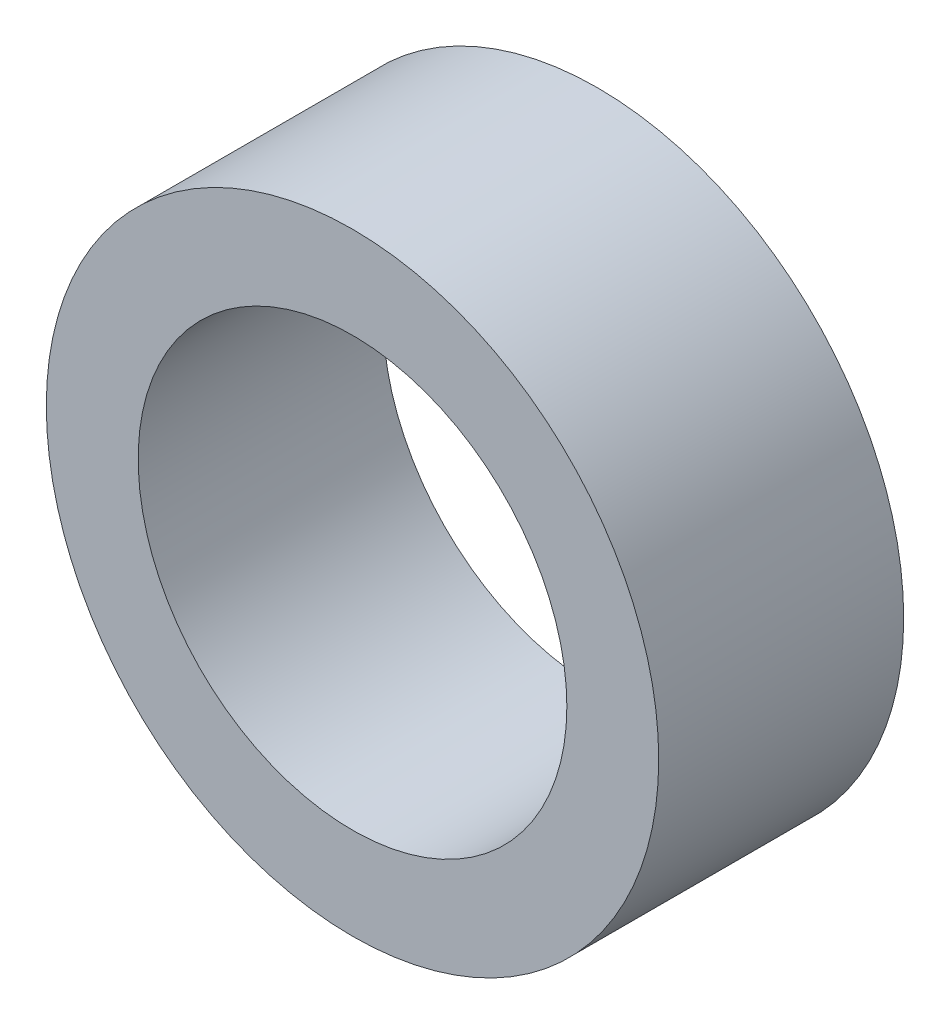
ISO-10303-21;
HEADER;
FILE_DESCRIPTION(('STEP AP214'),'2;1');
FILE_NAME('part.step','',(''),(''),'','','');
FILE_SCHEMA(('AUTOMOTIVE_DESIGN { 1 0 10303 214 1 1 1 1 }'));
ENDSEC;
DATA;
#1=APPLICATION_CONTEXT('core data for automotive mechanical design processes');
#2=APPLICATION_PROTOCOL_DEFINITION('international standard','automotive_design',2000,#1);
#3=PRODUCT_CONTEXT('',#1,'mechanical');
#4=PRODUCT('Part','Part','',(#3));
#5=PRODUCT_RELATED_PRODUCT_CATEGORY('part','',(#4));
#6=PRODUCT_DEFINITION_FORMATION('','',#4);
#7=PRODUCT_DEFINITION_CONTEXT('part definition',#1,'design');
#8=PRODUCT_DEFINITION('design','',#6,#7);
#9=PRODUCT_DEFINITION_SHAPE('','',#8);
#10=(LENGTH_UNIT() NAMED_UNIT(*) SI_UNIT(.MILLI.,.METRE.));
#11=(NAMED_UNIT(*) PLANE_ANGLE_UNIT() SI_UNIT($,.RADIAN.));
#12=(NAMED_UNIT(*) SI_UNIT($,.STERADIAN.) SOLID_ANGLE_UNIT());
#13=UNCERTAINTY_MEASURE_WITH_UNIT(LENGTH_MEASURE(1.E-05),#10,'distance_accuracy_value','');
#14=(GEOMETRIC_REPRESENTATION_CONTEXT(3) GLOBAL_UNCERTAINTY_ASSIGNED_CONTEXT((#13)) GLOBAL_UNIT_ASSIGNED_CONTEXT((#10,
#11,#12)) REPRESENTATION_CONTEXT('',''));
#15=CARTESIAN_POINT('',(0.,0.,0.));
#16=DIRECTION('',(0.,0.,1.));
#17=DIRECTION('',(1.,0.,0.));
#18=AXIS2_PLACEMENT_3D('',#15,#16,#17);
#19=CARTESIAN_POINT('',(0.,0.,20.));
#20=DIRECTION('',(0.,0.,1.));
#21=DIRECTION('',(1.,0.,0.));
#22=AXIS2_PLACEMENT_3D('',#19,#20,#21);
#23=PLANE('',#22);
#24=CARTESIAN_POINT('',(0.,0.,20.));
#25=DIRECTION('',(0.,0.,1.));
#26=DIRECTION('',(1.,0.,0.));
#27=AXIS2_PLACEMENT_3D('',#24,#25,#26);
#28=CIRCLE('',#27,25.);
#29=CARTESIAN_POINT('',(25.,0.,20.));
#30=VERTEX_POINT('',#29);
#31=EDGE_CURVE('E10',#30,#30,#28,.T.);
#32=ORIENTED_EDGE('',*,*,#31,.T.);
#33=EDGE_LOOP('',(#32));
#34=FACE_BOUND('',#33,.T.);
#35=CARTESIAN_POINT('',(0.,0.,20.));
#36=DIRECTION('',(0.,0.,1.));
#37=DIRECTION('',(1.,0.,0.));
#38=AXIS2_PLACEMENT_3D('',#35,#36,#37);
#39=CIRCLE('',#38,17.5);
#40=CARTESIAN_POINT('',(17.5,0.,20.));
#41=VERTEX_POINT('',#40);
#42=EDGE_CURVE('E42',#41,#41,#39,.T.);
#43=ORIENTED_EDGE('',*,*,#42,.F.);
#44=EDGE_LOOP('',(#43));
#45=FACE_BOUND('',#44,.T.);
#46=ADVANCED_FACE('F31',(#34,#45),#23,.T.);
#47=CARTESIAN_POINT('',(0.,0.,0.));
#48=DIRECTION('',(0.,0.,1.));
#49=DIRECTION('',(1.,0.,0.));
#50=AXIS2_PLACEMENT_3D('',#47,#48,#49);
#51=PLANE('',#50);
#52=CARTESIAN_POINT('',(0.,0.,0.));
#53=DIRECTION('',(0.,0.,1.));
#54=DIRECTION('',(1.,0.,0.));
#55=AXIS2_PLACEMENT_3D('',#52,#53,#54);
#56=CIRCLE('',#55,25.);
#57=CARTESIAN_POINT('',(25.,0.,0.));
#58=VERTEX_POINT('',#57);
#59=EDGE_CURVE('E35',#58,#58,#56,.T.);
#60=ORIENTED_EDGE('',*,*,#59,.F.);
#61=EDGE_LOOP('',(#60));
#62=FACE_BOUND('',#61,.T.);
#63=CARTESIAN_POINT('',(0.,0.,0.));
#64=DIRECTION('',(0.,0.,1.));
#65=DIRECTION('',(1.,0.,0.));
#66=AXIS2_PLACEMENT_3D('',#63,#64,#65);
#67=CIRCLE('',#66,17.5);
#68=CARTESIAN_POINT('',(17.5,0.,0.));
#69=VERTEX_POINT('',#68);
#70=EDGE_CURVE('E44',#69,#69,#67,.T.);
#71=ORIENTED_EDGE('',*,*,#70,.T.);
#72=EDGE_LOOP('',(#71));
#73=FACE_BOUND('',#72,.T.);
#74=ADVANCED_FACE('F54',(#62,#73),#51,.F.);
#75=CARTESIAN_POINT('',(0.,0.,20.));
#76=DIRECTION('',(0.,0.,-1.));
#77=DIRECTION('',(-1.,0.,0.));
#78=AXIS2_PLACEMENT_3D('',#75,#76,#77);
#79=CYLINDRICAL_SURFACE('',#78,25.);
#80=ORIENTED_EDGE('',*,*,#31,.F.);
#81=EDGE_LOOP('',(#80));
#82=FACE_BOUND('',#81,.T.);
#83=ORIENTED_EDGE('',*,*,#59,.T.);
#84=EDGE_LOOP('',(#83));
#85=FACE_BOUND('',#84,.T.);
#86=ADVANCED_FACE('F33',(#82,#85),#79,.T.);
#87=CARTESIAN_POINT('',(0.,0.,20.));
#88=DIRECTION('',(0.,0.,-1.));
#89=DIRECTION('',(-1.,0.,0.));
#90=AXIS2_PLACEMENT_3D('',#87,#88,#89);
#91=CYLINDRICAL_SURFACE('',#90,17.5);
#92=ORIENTED_EDGE('',*,*,#42,.T.);
#93=EDGE_LOOP('',(#92));
#94=FACE_BOUND('',#93,.T.);
#95=ORIENTED_EDGE('',*,*,#70,.F.);
#96=EDGE_LOOP('',(#95));
#97=FACE_BOUND('',#96,.T.);
#98=ADVANCED_FACE('F50',(#94,#97),#91,.F.);
#99=CLOSED_SHELL('',(#46,#74,#86,#98));
#100=MANIFOLD_SOLID_BREP('B2',#99);
#101=ADVANCED_BREP_SHAPE_REPRESENTATION('',(#18,#100),#14);
#102=SHAPE_DEFINITION_REPRESENTATION(#9,#101);
ENDSEC;
END-ISO-10303-21;
